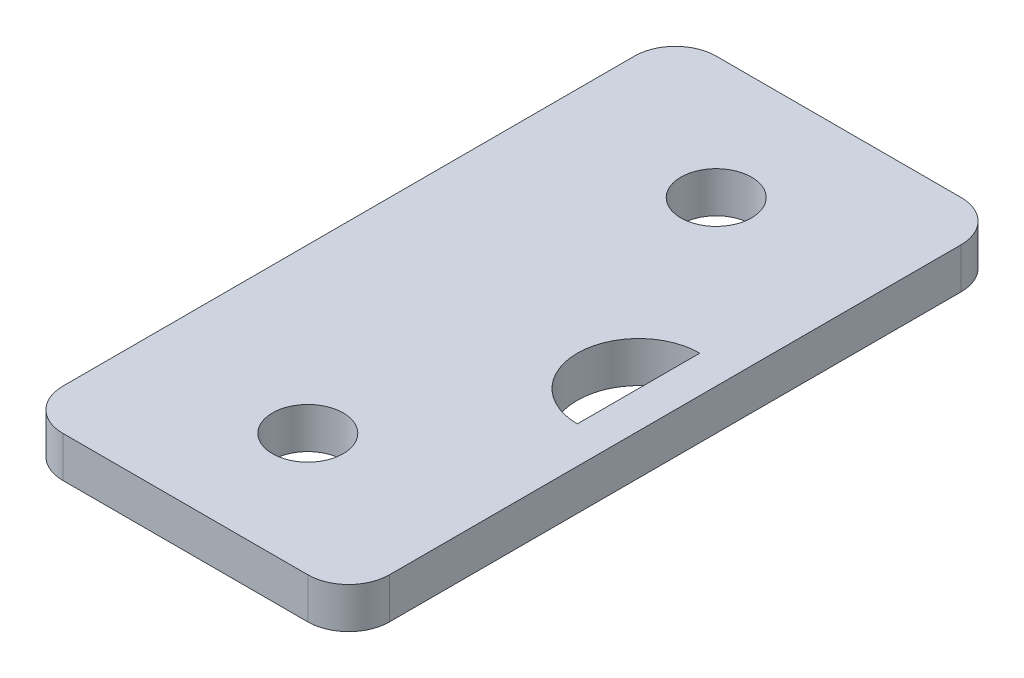
ISO-10303-21;
HEADER;
FILE_DESCRIPTION(('STEP AP214'),'2;1');
FILE_NAME('part.step','',(''),(''),'','','');
FILE_SCHEMA(('AUTOMOTIVE_DESIGN { 1 0 10303 214 1 1 1 1 }'));
ENDSEC;
DATA;
#1=APPLICATION_CONTEXT('core data for automotive mechanical design processes');
#2=APPLICATION_PROTOCOL_DEFINITION('international standard','automotive_design',2000,#1);
#3=PRODUCT_CONTEXT('',#1,'mechanical');
#4=PRODUCT('Part','Part','',(#3));
#5=PRODUCT_RELATED_PRODUCT_CATEGORY('part','',(#4));
#6=PRODUCT_DEFINITION_FORMATION('','',#4);
#7=PRODUCT_DEFINITION_CONTEXT('part definition',#1,'design');
#8=PRODUCT_DEFINITION('design','',#6,#7);
#9=PRODUCT_DEFINITION_SHAPE('','',#8);
#10=(LENGTH_UNIT() NAMED_UNIT(*) SI_UNIT(.MILLI.,.METRE.));
#11=(NAMED_UNIT(*) PLANE_ANGLE_UNIT() SI_UNIT($,.RADIAN.));
#12=(NAMED_UNIT(*) SI_UNIT($,.STERADIAN.) SOLID_ANGLE_UNIT());
#13=UNCERTAINTY_MEASURE_WITH_UNIT(LENGTH_MEASURE(1.E-05),#10,'distance_accuracy_value','');
#14=(GEOMETRIC_REPRESENTATION_CONTEXT(3) GLOBAL_UNCERTAINTY_ASSIGNED_CONTEXT((#13)) GLOBAL_UNIT_ASSIGNED_CONTEXT((#10,
#11,#12)) REPRESENTATION_CONTEXT('',''));
#15=CARTESIAN_POINT('',(0.,0.,0.));
#16=DIRECTION('',(0.,0.,1.));
#17=DIRECTION('',(1.,0.,0.));
#18=AXIS2_PLACEMENT_3D('',#15,#16,#17);
#19=CARTESIAN_POINT('',(12.7,3.175,-25.4));
#20=DIRECTION('',(-1.,0.,0.));
#21=DIRECTION('',(0.,0.,1.));
#22=AXIS2_PLACEMENT_3D('',#19,#20,#21);
#23=PLANE('',#22);
#24=DIRECTION('',(0.,0.,-1.));
#25=VECTOR('',#24,1.);
#26=CARTESIAN_POINT('',(12.7,0.,-25.4));
#27=LINE('',#26,#25);
#28=CARTESIAN_POINT('',(12.7,0.,22.225));
#29=VERTEX_POINT('',#28);
#30=CARTESIAN_POINT('',(12.7,0.,-22.225));
#31=VERTEX_POINT('',#30);
#32=EDGE_CURVE('E140',#29,#31,#27,.T.);
#33=ORIENTED_EDGE('',*,*,#32,.T.);
#34=DIRECTION('',(0.,-1.,0.));
#35=VECTOR('',#34,1.);
#36=CARTESIAN_POINT('',(12.7,3.175,-22.225));
#37=LINE('',#36,#35);
#38=CARTESIAN_POINT('',(12.7,3.175,-22.225));
#39=VERTEX_POINT('',#38);
#40=EDGE_CURVE('E178',#31,#39,#37,.F.);
#41=ORIENTED_EDGE('',*,*,#40,.T.);
#42=DIRECTION('',(0.,0.,-1.));
#43=VECTOR('',#42,1.);
#44=CARTESIAN_POINT('',(12.7,3.175,-25.4));
#45=LINE('',#44,#43);
#46=CARTESIAN_POINT('',(12.7,3.175,22.225));
#47=VERTEX_POINT('',#46);
#48=EDGE_CURVE('E142',#47,#39,#45,.T.);
#49=ORIENTED_EDGE('',*,*,#48,.F.);
#50=DIRECTION('',(0.,-1.,0.));
#51=VECTOR('',#50,1.);
#52=CARTESIAN_POINT('',(12.7,3.175,22.225));
#53=LINE('',#52,#51);
#54=EDGE_CURVE('E175',#47,#29,#53,.T.);
#55=ORIENTED_EDGE('',*,*,#54,.T.);
#56=EDGE_LOOP('',(#33,#41,#49,#55));
#57=FACE_BOUND('',#56,.T.);
#58=ADVANCED_FACE('F36',(#57),#23,.F.);
#59=CARTESIAN_POINT('',(-12.7,3.175,-25.4));
#60=DIRECTION('',(0.,0.,1.));
#61=DIRECTION('',(1.,0.,0.));
#62=AXIS2_PLACEMENT_3D('',#59,#60,#61);
#63=PLANE('',#62);
#64=DIRECTION('',(-1.,0.,0.));
#65=VECTOR('',#64,1.);
#66=CARTESIAN_POINT('',(-12.7,3.175,-25.4));
#67=LINE('',#66,#65);
#68=CARTESIAN_POINT('',(9.525,3.175,-25.4));
#69=VERTEX_POINT('',#68);
#70=CARTESIAN_POINT('',(-9.525,3.175,-25.4));
#71=VERTEX_POINT('',#70);
#72=EDGE_CURVE('E145',#69,#71,#67,.T.);
#73=ORIENTED_EDGE('',*,*,#72,.F.);
#74=DIRECTION('',(0.,-1.,0.));
#75=VECTOR('',#74,1.);
#76=CARTESIAN_POINT('',(9.525,3.175,-25.4));
#77=LINE('',#76,#75);
#78=CARTESIAN_POINT('',(9.525,0.,-25.4));
#79=VERTEX_POINT('',#78);
#80=EDGE_CURVE('E164',#69,#79,#77,.T.);
#81=ORIENTED_EDGE('',*,*,#80,.T.);
#82=DIRECTION('',(-1.,0.,0.));
#83=VECTOR('',#82,1.);
#84=CARTESIAN_POINT('',(-12.7,0.,-25.4));
#85=LINE('',#84,#83);
#86=CARTESIAN_POINT('',(-9.525,0.,-25.4));
#87=VERTEX_POINT('',#86);
#88=EDGE_CURVE('E156',#79,#87,#85,.T.);
#89=ORIENTED_EDGE('',*,*,#88,.T.);
#90=DIRECTION('',(0.,-1.,0.));
#91=VECTOR('',#90,1.);
#92=CARTESIAN_POINT('',(-9.525,3.175,-25.4));
#93=LINE('',#92,#91);
#94=EDGE_CURVE('E153',#87,#71,#93,.F.);
#95=ORIENTED_EDGE('',*,*,#94,.T.);
#96=EDGE_LOOP('',(#73,#81,#89,#95));
#97=FACE_BOUND('',#96,.T.);
#98=ADVANCED_FACE('F220',(#97),#63,.F.);
#99=CARTESIAN_POINT('',(-12.7,3.175,-25.4));
#100=DIRECTION('',(1.,0.,0.));
#101=DIRECTION('',(0.,0.,-1.));
#102=AXIS2_PLACEMENT_3D('',#99,#100,#101);
#103=PLANE('',#102);
#104=DIRECTION('',(0.,0.,1.));
#105=VECTOR('',#104,1.);
#106=CARTESIAN_POINT('',(-12.7,3.175,-25.4));
#107=LINE('',#106,#105);
#108=CARTESIAN_POINT('',(-12.7,3.175,-22.225));
#109=VERTEX_POINT('',#108);
#110=CARTESIAN_POINT('',(-12.7,3.175,22.225));
#111=VERTEX_POINT('',#110);
#112=EDGE_CURVE('E149',#109,#111,#107,.T.);
#113=ORIENTED_EDGE('',*,*,#112,.F.);
#114=DIRECTION('',(0.,-1.,0.));
#115=VECTOR('',#114,1.);
#116=CARTESIAN_POINT('',(-12.7,3.175,-22.225));
#117=LINE('',#116,#115);
#118=CARTESIAN_POINT('',(-12.7,0.,-22.225));
#119=VERTEX_POINT('',#118);
#120=EDGE_CURVE('E189',#109,#119,#117,.T.);
#121=ORIENTED_EDGE('',*,*,#120,.T.);
#122=DIRECTION('',(0.,0.,1.));
#123=VECTOR('',#122,1.);
#124=CARTESIAN_POINT('',(-12.7,0.,-25.4));
#125=LINE('',#124,#123);
#126=CARTESIAN_POINT('',(-12.7,0.,22.225));
#127=VERTEX_POINT('',#126);
#128=EDGE_CURVE('E159',#119,#127,#125,.T.);
#129=ORIENTED_EDGE('',*,*,#128,.T.);
#130=DIRECTION('',(0.,-1.,0.));
#131=VECTOR('',#130,1.);
#132=CARTESIAN_POINT('',(-12.7,3.175,22.225));
#133=LINE('',#132,#131);
#134=EDGE_CURVE('E187',#127,#111,#133,.F.);
#135=ORIENTED_EDGE('',*,*,#134,.T.);
#136=EDGE_LOOP('',(#113,#121,#129,#135));
#137=FACE_BOUND('',#136,.T.);
#138=ADVANCED_FACE('F195',(#137),#103,.F.);
#139=CARTESIAN_POINT('',(-12.7,3.175,25.4));
#140=DIRECTION('',(0.,0.,-1.));
#141=DIRECTION('',(-1.,0.,0.));
#142=AXIS2_PLACEMENT_3D('',#139,#140,#141);
#143=PLANE('',#142);
#144=DIRECTION('',(1.,0.,0.));
#145=VECTOR('',#144,1.);
#146=CARTESIAN_POINT('',(-12.7,3.175,25.4));
#147=LINE('',#146,#145);
#148=CARTESIAN_POINT('',(-9.525,3.175,25.4));
#149=VERTEX_POINT('',#148);
#150=CARTESIAN_POINT('',(9.525,3.175,25.4));
#151=VERTEX_POINT('',#150);
#152=EDGE_CURVE('E151',#149,#151,#147,.T.);
#153=ORIENTED_EDGE('',*,*,#152,.F.);
#154=DIRECTION('',(0.,-1.,0.));
#155=VECTOR('',#154,1.);
#156=CARTESIAN_POINT('',(-9.525,3.175,25.4));
#157=LINE('',#156,#155);
#158=CARTESIAN_POINT('',(-9.525,0.,25.4));
#159=VERTEX_POINT('',#158);
#160=EDGE_CURVE('E11',#149,#159,#157,.T.);
#161=ORIENTED_EDGE('',*,*,#160,.T.);
#162=DIRECTION('',(1.,0.,0.));
#163=VECTOR('',#162,1.);
#164=CARTESIAN_POINT('',(-12.7,0.,25.4));
#165=LINE('',#164,#163);
#166=CARTESIAN_POINT('',(9.525,0.,25.4));
#167=VERTEX_POINT('',#166);
#168=EDGE_CURVE('E146',#159,#167,#165,.T.);
#169=ORIENTED_EDGE('',*,*,#168,.T.);
#170=DIRECTION('',(0.,-1.,0.));
#171=VECTOR('',#170,1.);
#172=CARTESIAN_POINT('',(9.525,3.175,25.4));
#173=LINE('',#172,#171);
#174=EDGE_CURVE('E44',#167,#151,#173,.F.);
#175=ORIENTED_EDGE('',*,*,#174,.T.);
#176=EDGE_LOOP('',(#153,#161,#169,#175));
#177=FACE_BOUND('',#176,.T.);
#178=ADVANCED_FACE('F206',(#177),#143,.F.);
#179=CARTESIAN_POINT('',(0.,3.175,0.));
#180=DIRECTION('',(0.,1.,0.));
#181=DIRECTION('',(0.,0.,1.));
#182=AXIS2_PLACEMENT_3D('',#179,#180,#181);
#183=PLANE('',#182);
#184=CARTESIAN_POINT('',(0.,3.175,-15.875));
#185=DIRECTION('',(0.,-1.,0.));
#186=DIRECTION('',(0.,0.,-1.));
#187=AXIS2_PLACEMENT_3D('',#184,#185,#186);
#188=CIRCLE('',#187,2.75);
#189=CARTESIAN_POINT('',(0.,3.175,-18.625));
#190=VERTEX_POINT('',#189);
#191=EDGE_CURVE('E263',#190,#190,#188,.T.);
#192=ORIENTED_EDGE('',*,*,#191,.T.);
#193=EDGE_LOOP('',(#192));
#194=FACE_BOUND('',#193,.T.);
#195=CARTESIAN_POINT('',(0.,3.175,15.875));
#196=DIRECTION('',(0.,-1.,0.));
#197=DIRECTION('',(0.,0.,-1.));
#198=AXIS2_PLACEMENT_3D('',#195,#196,#197);
#199=CIRCLE('',#198,2.75);
#200=CARTESIAN_POINT('',(0.,3.175,13.125));
#201=VERTEX_POINT('',#200);
#202=EDGE_CURVE('E136',#201,#201,#199,.T.);
#203=ORIENTED_EDGE('',*,*,#202,.T.);
#204=EDGE_LOOP('',(#203));
#205=FACE_BOUND('',#204,.T.);
#206=CARTESIAN_POINT('',(9.8425,3.175,0.));
#207=DIRECTION('',(0.,-1.,0.));
#208=DIRECTION('',(0.,0.,-1.));
#209=AXIS2_PLACEMENT_3D('',#206,#207,#208);
#210=CIRCLE('',#209,4.7625);
#211=CARTESIAN_POINT('',(9.8425,3.175,4.7625));
#212=VERTEX_POINT('',#211);
#213=CARTESIAN_POINT('',(9.8425,3.175,-4.7625));
#214=VERTEX_POINT('',#213);
#215=EDGE_CURVE('E117',#212,#214,#210,.T.);
#216=ORIENTED_EDGE('',*,*,#215,.T.);
#217=DIRECTION('',(0.,0.,1.));
#218=VECTOR('',#217,1.);
#219=CARTESIAN_POINT('',(9.8425,3.175,4.7625));
#220=LINE('',#219,#218);
#221=EDGE_CURVE('E125',#214,#212,#220,.T.);
#222=ORIENTED_EDGE('',*,*,#221,.T.);
#223=EDGE_LOOP('',(#216,#222));
#224=FACE_BOUND('',#223,.T.);
#225=ORIENTED_EDGE('',*,*,#48,.T.);
#226=CARTESIAN_POINT('',(9.525,3.175,-22.225));
#227=DIRECTION('',(0.,1.,0.));
#228=DIRECTION('',(0.,0.,1.));
#229=AXIS2_PLACEMENT_3D('',#226,#227,#228);
#230=CIRCLE('',#229,3.175);
#231=EDGE_CURVE('E185',#39,#69,#230,.T.);
#232=ORIENTED_EDGE('',*,*,#231,.T.);
#233=ORIENTED_EDGE('',*,*,#72,.T.);
#234=CARTESIAN_POINT('',(-9.525,3.175,-22.225));
#235=DIRECTION('',(0.,1.,0.));
#236=DIRECTION('',(0.,0.,1.));
#237=AXIS2_PLACEMENT_3D('',#234,#235,#236);
#238=CIRCLE('',#237,3.175);
#239=EDGE_CURVE('E183',#71,#109,#238,.T.);
#240=ORIENTED_EDGE('',*,*,#239,.T.);
#241=ORIENTED_EDGE('',*,*,#112,.T.);
#242=CARTESIAN_POINT('',(-9.525,3.175,22.225));
#243=DIRECTION('',(0.,1.,0.));
#244=DIRECTION('',(0.,0.,1.));
#245=AXIS2_PLACEMENT_3D('',#242,#243,#244);
#246=CIRCLE('',#245,3.175);
#247=EDGE_CURVE('E57',#111,#149,#246,.T.);
#248=ORIENTED_EDGE('',*,*,#247,.T.);
#249=ORIENTED_EDGE('',*,*,#152,.T.);
#250=CARTESIAN_POINT('',(9.525,3.175,22.225));
#251=DIRECTION('',(0.,1.,0.));
#252=DIRECTION('',(0.,0.,1.));
#253=AXIS2_PLACEMENT_3D('',#250,#251,#252);
#254=CIRCLE('',#253,3.175);
#255=EDGE_CURVE('E180',#151,#47,#254,.T.);
#256=ORIENTED_EDGE('',*,*,#255,.T.);
#257=EDGE_LOOP('',(#225,#232,#233,#240,#241,#248,#249,#256));
#258=FACE_BOUND('',#257,.T.);
#259=ADVANCED_FACE('F131',(#194,#205,#224,#258),#183,.T.);
#260=CARTESIAN_POINT('',(0.,0.,0.));
#261=DIRECTION('',(0.,1.,0.));
#262=DIRECTION('',(0.,0.,1.));
#263=AXIS2_PLACEMENT_3D('',#260,#261,#262);
#264=PLANE('',#263);
#265=CARTESIAN_POINT('',(0.,0.,-15.875));
#266=DIRECTION('',(0.,-1.,0.));
#267=DIRECTION('',(0.,0.,-1.));
#268=AXIS2_PLACEMENT_3D('',#265,#266,#267);
#269=CIRCLE('',#268,2.74999999999999);
#270=CARTESIAN_POINT('',(0.,0.,-18.625));
#271=VERTEX_POINT('',#270);
#272=EDGE_CURVE('E266',#271,#271,#269,.T.);
#273=ORIENTED_EDGE('',*,*,#272,.F.);
#274=EDGE_LOOP('',(#273));
#275=FACE_BOUND('',#274,.T.);
#276=CARTESIAN_POINT('',(0.,0.,15.875));
#277=DIRECTION('',(0.,-1.,0.));
#278=DIRECTION('',(0.,0.,-1.));
#279=AXIS2_PLACEMENT_3D('',#276,#277,#278);
#280=CIRCLE('',#279,2.74999999999999);
#281=CARTESIAN_POINT('',(0.,0.,13.125));
#282=VERTEX_POINT('',#281);
#283=EDGE_CURVE('E268',#282,#282,#280,.T.);
#284=ORIENTED_EDGE('',*,*,#283,.F.);
#285=EDGE_LOOP('',(#284));
#286=FACE_BOUND('',#285,.T.);
#287=DIRECTION('',(0.,0.,1.));
#288=VECTOR('',#287,1.);
#289=CARTESIAN_POINT('',(9.8425,0.,4.7625));
#290=LINE('',#289,#288);
#291=CARTESIAN_POINT('',(9.8425,0.,-4.7625));
#292=VERTEX_POINT('',#291);
#293=CARTESIAN_POINT('',(9.8425,0.,4.7625));
#294=VERTEX_POINT('',#293);
#295=EDGE_CURVE('E132',#292,#294,#290,.T.);
#296=ORIENTED_EDGE('',*,*,#295,.F.);
#297=CARTESIAN_POINT('',(9.8425,0.,0.));
#298=DIRECTION('',(0.,-1.,0.));
#299=DIRECTION('',(0.,0.,-1.));
#300=AXIS2_PLACEMENT_3D('',#297,#298,#299);
#301=CIRCLE('',#300,4.7625);
#302=EDGE_CURVE('E120',#294,#292,#301,.T.);
#303=ORIENTED_EDGE('',*,*,#302,.F.);
#304=EDGE_LOOP('',(#296,#303));
#305=FACE_BOUND('',#304,.T.);
#306=ORIENTED_EDGE('',*,*,#88,.F.);
#307=CARTESIAN_POINT('',(9.525,0.,-22.225));
#308=DIRECTION('',(0.,1.,0.));
#309=DIRECTION('',(0.,0.,1.));
#310=AXIS2_PLACEMENT_3D('',#307,#308,#309);
#311=CIRCLE('',#310,3.175);
#312=EDGE_CURVE('E173',#79,#31,#311,.F.);
#313=ORIENTED_EDGE('',*,*,#312,.T.);
#314=ORIENTED_EDGE('',*,*,#32,.F.);
#315=CARTESIAN_POINT('',(9.525,0.,22.225));
#316=DIRECTION('',(0.,1.,0.));
#317=DIRECTION('',(0.,0.,1.));
#318=AXIS2_PLACEMENT_3D('',#315,#316,#317);
#319=CIRCLE('',#318,3.175);
#320=EDGE_CURVE('E167',#29,#167,#319,.F.);
#321=ORIENTED_EDGE('',*,*,#320,.T.);
#322=ORIENTED_EDGE('',*,*,#168,.F.);
#323=CARTESIAN_POINT('',(-9.525,0.,22.225));
#324=DIRECTION('',(0.,1.,0.));
#325=DIRECTION('',(0.,0.,1.));
#326=AXIS2_PLACEMENT_3D('',#323,#324,#325);
#327=CIRCLE('',#326,3.175);
#328=EDGE_CURVE('E169',#159,#127,#327,.F.);
#329=ORIENTED_EDGE('',*,*,#328,.T.);
#330=ORIENTED_EDGE('',*,*,#128,.F.);
#331=CARTESIAN_POINT('',(-9.525,0.,-22.225));
#332=DIRECTION('',(0.,1.,0.));
#333=DIRECTION('',(0.,0.,1.));
#334=AXIS2_PLACEMENT_3D('',#331,#332,#333);
#335=CIRCLE('',#334,3.175);
#336=EDGE_CURVE('E171',#119,#87,#335,.F.);
#337=ORIENTED_EDGE('',*,*,#336,.T.);
#338=EDGE_LOOP('',(#306,#313,#314,#321,#322,#329,#330,#337));
#339=FACE_BOUND('',#338,.T.);
#340=ADVANCED_FACE('F201',(#275,#286,#305,#339),#264,.F.);
#341=CARTESIAN_POINT('',(9.8425,3.175,0.));
#342=DIRECTION('',(0.,-1.,0.));
#343=DIRECTION('',(0.,0.,-1.));
#344=AXIS2_PLACEMENT_3D('',#341,#342,#343);
#345=CYLINDRICAL_SURFACE('',#344,4.7625);
#346=ORIENTED_EDGE('',*,*,#302,.T.);
#347=DIRECTION('',(0.,-1.,0.));
#348=VECTOR('',#347,1.);
#349=CARTESIAN_POINT('',(9.8425,3.175,-4.7625));
#350=LINE('',#349,#348);
#351=EDGE_CURVE('E113',#214,#292,#350,.T.);
#352=ORIENTED_EDGE('',*,*,#351,.F.);
#353=ORIENTED_EDGE('',*,*,#215,.F.);
#354=DIRECTION('',(0.,-1.,0.));
#355=VECTOR('',#354,1.);
#356=CARTESIAN_POINT('',(9.8425,3.175,4.7625));
#357=LINE('',#356,#355);
#358=EDGE_CURVE('E124',#212,#294,#357,.T.);
#359=ORIENTED_EDGE('',*,*,#358,.T.);
#360=EDGE_LOOP('',(#346,#352,#353,#359));
#361=FACE_BOUND('',#360,.T.);
#362=ADVANCED_FACE('F115',(#361),#345,.F.);
#363=CARTESIAN_POINT('',(9.8425,3.175,4.7625));
#364=DIRECTION('',(1.,0.,0.));
#365=DIRECTION('',(0.,0.,-1.));
#366=AXIS2_PLACEMENT_3D('',#363,#364,#365);
#367=PLANE('',#366);
#368=ORIENTED_EDGE('',*,*,#295,.T.);
#369=ORIENTED_EDGE('',*,*,#358,.F.);
#370=ORIENTED_EDGE('',*,*,#221,.F.);
#371=ORIENTED_EDGE('',*,*,#351,.T.);
#372=EDGE_LOOP('',(#368,#369,#370,#371));
#373=FACE_BOUND('',#372,.T.);
#374=ADVANCED_FACE('F128',(#373),#367,.F.);
#375=CARTESIAN_POINT('',(0.,0.,15.875));
#376=DIRECTION('',(0.,-1.,0.));
#377=DIRECTION('',(0.,0.,-1.));
#378=AXIS2_PLACEMENT_3D('',#375,#376,#377);
#379=CYLINDRICAL_SURFACE('',#378,2.74999999999999);
#380=ORIENTED_EDGE('',*,*,#202,.F.);
#381=EDGE_LOOP('',(#380));
#382=FACE_BOUND('',#381,.T.);
#383=ORIENTED_EDGE('',*,*,#283,.T.);
#384=EDGE_LOOP('',(#383));
#385=FACE_BOUND('',#384,.T.);
#386=ADVANCED_FACE('F252',(#382,#385),#379,.F.);
#387=CARTESIAN_POINT('',(0.,0.,-15.875));
#388=DIRECTION('',(0.,-1.,0.));
#389=DIRECTION('',(0.,0.,-1.));
#390=AXIS2_PLACEMENT_3D('',#387,#388,#389);
#391=CYLINDRICAL_SURFACE('',#390,2.74999999999999);
#392=ORIENTED_EDGE('',*,*,#191,.F.);
#393=EDGE_LOOP('',(#392));
#394=FACE_BOUND('',#393,.T.);
#395=ORIENTED_EDGE('',*,*,#272,.T.);
#396=EDGE_LOOP('',(#395));
#397=FACE_BOUND('',#396,.T.);
#398=ADVANCED_FACE('F229',(#394,#397),#391,.F.);
#399=CARTESIAN_POINT('',(9.525,3.175,-22.225));
#400=DIRECTION('',(0.,-1.,0.));
#401=DIRECTION('',(0.,0.,-1.));
#402=AXIS2_PLACEMENT_3D('',#399,#400,#401);
#403=CYLINDRICAL_SURFACE('',#402,3.175);
#404=ORIENTED_EDGE('',*,*,#231,.F.);
#405=ORIENTED_EDGE('',*,*,#40,.F.);
#406=ORIENTED_EDGE('',*,*,#312,.F.);
#407=ORIENTED_EDGE('',*,*,#80,.F.);
#408=EDGE_LOOP('',(#404,#405,#406,#407));
#409=FACE_BOUND('',#408,.T.);
#410=ADVANCED_FACE('F217',(#409),#403,.T.);
#411=CARTESIAN_POINT('',(-9.525,3.175,-22.225));
#412=DIRECTION('',(0.,-1.,0.));
#413=DIRECTION('',(0.,0.,-1.));
#414=AXIS2_PLACEMENT_3D('',#411,#412,#413);
#415=CYLINDRICAL_SURFACE('',#414,3.175);
#416=ORIENTED_EDGE('',*,*,#239,.F.);
#417=ORIENTED_EDGE('',*,*,#94,.F.);
#418=ORIENTED_EDGE('',*,*,#336,.F.);
#419=ORIENTED_EDGE('',*,*,#120,.F.);
#420=EDGE_LOOP('',(#416,#417,#418,#419));
#421=FACE_BOUND('',#420,.T.);
#422=ADVANCED_FACE('F222',(#421),#415,.T.);
#423=CARTESIAN_POINT('',(-9.525,3.175,22.225));
#424=DIRECTION('',(0.,-1.,0.));
#425=DIRECTION('',(0.,0.,-1.));
#426=AXIS2_PLACEMENT_3D('',#423,#424,#425);
#427=CYLINDRICAL_SURFACE('',#426,3.175);
#428=ORIENTED_EDGE('',*,*,#247,.F.);
#429=ORIENTED_EDGE('',*,*,#134,.F.);
#430=ORIENTED_EDGE('',*,*,#328,.F.);
#431=ORIENTED_EDGE('',*,*,#160,.F.);
#432=EDGE_LOOP('',(#428,#429,#430,#431));
#433=FACE_BOUND('',#432,.T.);
#434=ADVANCED_FACE('F205',(#433),#427,.T.);
#435=CARTESIAN_POINT('',(9.525,3.175,22.225));
#436=DIRECTION('',(0.,-1.,0.));
#437=DIRECTION('',(0.,0.,-1.));
#438=AXIS2_PLACEMENT_3D('',#435,#436,#437);
#439=CYLINDRICAL_SURFACE('',#438,3.175);
#440=ORIENTED_EDGE('',*,*,#255,.F.);
#441=ORIENTED_EDGE('',*,*,#174,.F.);
#442=ORIENTED_EDGE('',*,*,#320,.F.);
#443=ORIENTED_EDGE('',*,*,#54,.F.);
#444=EDGE_LOOP('',(#440,#441,#442,#443));
#445=FACE_BOUND('',#444,.T.);
#446=ADVANCED_FACE('F38',(#445),#439,.T.);
#447=CLOSED_SHELL('',(#58,#98,#138,#178,#259,#340,#362,#374,#386,#398,#410,#422,#434,#446));
#448=MANIFOLD_SOLID_BREP('B2',#447);
#449=ADVANCED_BREP_SHAPE_REPRESENTATION('',(#18,#448),#14);
#450=SHAPE_DEFINITION_REPRESENTATION(#9,#449);
ENDSEC;
END-ISO-10303-21;
